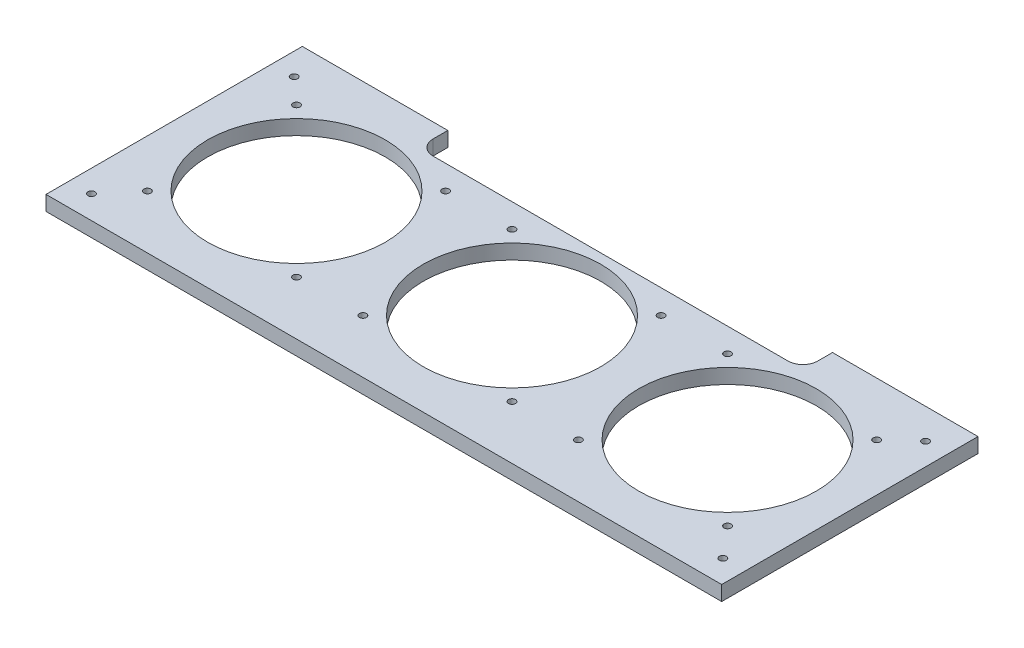
ISO-10303-21;
HEADER;
FILE_DESCRIPTION(('STEP AP214'),'2;1');
FILE_NAME('part.step','',(''),(''),'','','');
FILE_SCHEMA(('AUTOMOTIVE_DESIGN { 1 0 10303 214 1 1 1 1 }'));
ENDSEC;
DATA;
#1=APPLICATION_CONTEXT('core data for automotive mechanical design processes');
#2=APPLICATION_PROTOCOL_DEFINITION('international standard','automotive_design',2000,#1);
#3=PRODUCT_CONTEXT('',#1,'mechanical');
#4=PRODUCT('Part','Part','',(#3));
#5=PRODUCT_RELATED_PRODUCT_CATEGORY('part','',(#4));
#6=PRODUCT_DEFINITION_FORMATION('','',#4);
#7=PRODUCT_DEFINITION_CONTEXT('part definition',#1,'design');
#8=PRODUCT_DEFINITION('design','',#6,#7);
#9=PRODUCT_DEFINITION_SHAPE('','',#8);
#10=(LENGTH_UNIT() NAMED_UNIT(*) SI_UNIT(.MILLI.,.METRE.));
#11=(NAMED_UNIT(*) PLANE_ANGLE_UNIT() SI_UNIT($,.RADIAN.));
#12=(NAMED_UNIT(*) SI_UNIT($,.STERADIAN.) SOLID_ANGLE_UNIT());
#13=UNCERTAINTY_MEASURE_WITH_UNIT(LENGTH_MEASURE(1.E-05),#10,'distance_accuracy_value','');
#14=(GEOMETRIC_REPRESENTATION_CONTEXT(3) GLOBAL_UNCERTAINTY_ASSIGNED_CONTEXT((#13)) GLOBAL_UNIT_ASSIGNED_CONTEXT((#10,
#11,#12)) REPRESENTATION_CONTEXT('',''));
#15=CARTESIAN_POINT('',(0.,0.,0.));
#16=DIRECTION('',(0.,0.,1.));
#17=DIRECTION('',(1.,0.,0.));
#18=AXIS2_PLACEMENT_3D('',#15,#16,#17);
#19=CARTESIAN_POINT('',(0.,3.175,-55.));
#20=DIRECTION('',(0.,0.,1.));
#21=DIRECTION('',(1.,0.,0.));
#22=AXIS2_PLACEMENT_3D('',#19,#20,#21);
#23=PLANE('',#22);
#24=DIRECTION('',(-1.,0.,0.));
#25=VECTOR('',#24,1.);
#26=CARTESIAN_POINT('',(0.,0.,-55.));
#27=LINE('',#26,#25);
#28=CARTESIAN_POINT('',(145.,0.,-55.));
#29=VERTEX_POINT('',#28);
#30=CARTESIAN_POINT('',(113.775,0.,-55.));
#31=VERTEX_POINT('',#30);
#32=EDGE_CURVE('E257',#29,#31,#27,.T.);
#33=ORIENTED_EDGE('',*,*,#32,.T.);
#34=DIRECTION('',(0.,-1.,0.));
#35=VECTOR('',#34,1.);
#36=CARTESIAN_POINT('',(113.775,3.175,-55.));
#37=LINE('',#36,#35);
#38=CARTESIAN_POINT('',(113.775,3.175,-55.));
#39=VERTEX_POINT('',#38);
#40=EDGE_CURVE('E209',#39,#31,#37,.T.);
#41=ORIENTED_EDGE('',*,*,#40,.F.);
#42=DIRECTION('',(-1.,0.,0.));
#43=VECTOR('',#42,1.);
#44=CARTESIAN_POINT('',(0.,3.175,-55.));
#45=LINE('',#44,#43);
#46=CARTESIAN_POINT('',(145.,3.175,-55.));
#47=VERTEX_POINT('',#46);
#48=EDGE_CURVE('E168',#47,#39,#45,.T.);
#49=ORIENTED_EDGE('',*,*,#48,.F.);
#50=DIRECTION('',(0.,-1.,0.));
#51=VECTOR('',#50,1.);
#52=CARTESIAN_POINT('',(145.,3.175,-55.));
#53=LINE('',#52,#51);
#54=EDGE_CURVE('E268',#47,#29,#53,.T.);
#55=ORIENTED_EDGE('',*,*,#54,.T.);
#56=EDGE_LOOP('',(#33,#41,#49,#55));
#57=FACE_BOUND('',#56,.T.);
#58=ADVANCED_FACE('F41',(#57),#23,.F.);
#59=CARTESIAN_POINT('',(0.,3.175,0.));
#60=DIRECTION('',(1.,0.,0.));
#61=DIRECTION('',(0.,0.,-1.));
#62=AXIS2_PLACEMENT_3D('',#59,#60,#61);
#63=PLANE('',#62);
#64=DIRECTION('',(0.,0.,1.));
#65=VECTOR('',#64,1.);
#66=CARTESIAN_POINT('',(0.,0.,0.));
#67=LINE('',#66,#65);
#68=CARTESIAN_POINT('',(0.,0.,-55.));
#69=VERTEX_POINT('',#68);
#70=CARTESIAN_POINT('',(0.,0.,0.));
#71=VERTEX_POINT('',#70);
#72=EDGE_CURVE('E176',#69,#71,#67,.T.);
#73=ORIENTED_EDGE('',*,*,#72,.T.);
#74=DIRECTION('',(0.,-1.,0.));
#75=VECTOR('',#74,1.);
#76=CARTESIAN_POINT('',(0.,3.175,0.));
#77=LINE('',#76,#75);
#78=CARTESIAN_POINT('',(0.,3.175,0.));
#79=VERTEX_POINT('',#78);
#80=EDGE_CURVE('E12',#79,#71,#77,.T.);
#81=ORIENTED_EDGE('',*,*,#80,.F.);
#82=DIRECTION('',(0.,0.,1.));
#83=VECTOR('',#82,1.);
#84=CARTESIAN_POINT('',(0.,3.175,0.));
#85=LINE('',#84,#83);
#86=CARTESIAN_POINT('',(0.,3.175,-55.));
#87=VERTEX_POINT('',#86);
#88=EDGE_CURVE('E254',#87,#79,#85,.T.);
#89=ORIENTED_EDGE('',*,*,#88,.F.);
#90=DIRECTION('',(0.,-1.,0.));
#91=VECTOR('',#90,1.);
#92=CARTESIAN_POINT('',(0.,3.175,-55.));
#93=LINE('',#92,#91);
#94=EDGE_CURVE('E172',#87,#69,#93,.T.);
#95=ORIENTED_EDGE('',*,*,#94,.T.);
#96=EDGE_LOOP('',(#73,#81,#89,#95));
#97=FACE_BOUND('',#96,.T.);
#98=ADVANCED_FACE('F43',(#97),#63,.F.);
#99=CARTESIAN_POINT('',(0.,3.175,0.));
#100=DIRECTION('',(0.,0.,-1.));
#101=DIRECTION('',(-1.,0.,0.));
#102=AXIS2_PLACEMENT_3D('',#99,#100,#101);
#103=PLANE('',#102);
#104=DIRECTION('',(1.,0.,0.));
#105=VECTOR('',#104,1.);
#106=CARTESIAN_POINT('',(0.,0.,0.));
#107=LINE('',#106,#105);
#108=CARTESIAN_POINT('',(145.,0.,0.));
#109=VERTEX_POINT('',#108);
#110=EDGE_CURVE('E298',#71,#109,#107,.T.);
#111=ORIENTED_EDGE('',*,*,#110,.T.);
#112=DIRECTION('',(0.,-1.,0.));
#113=VECTOR('',#112,1.);
#114=CARTESIAN_POINT('',(145.,3.175,0.));
#115=LINE('',#114,#113);
#116=CARTESIAN_POINT('',(145.,3.175,0.));
#117=VERTEX_POINT('',#116);
#118=EDGE_CURVE('E49',#117,#109,#115,.T.);
#119=ORIENTED_EDGE('',*,*,#118,.F.);
#120=DIRECTION('',(1.,0.,0.));
#121=VECTOR('',#120,1.);
#122=CARTESIAN_POINT('',(0.,3.175,0.));
#123=LINE('',#122,#121);
#124=EDGE_CURVE('E94',#79,#117,#123,.T.);
#125=ORIENTED_EDGE('',*,*,#124,.F.);
#126=ORIENTED_EDGE('',*,*,#80,.T.);
#127=EDGE_LOOP('',(#111,#119,#125,#126));
#128=FACE_BOUND('',#127,.T.);
#129=ADVANCED_FACE('F297',(#128),#103,.F.);
#130=CARTESIAN_POINT('',(145.,3.175,0.));
#131=DIRECTION('',(-1.,0.,0.));
#132=DIRECTION('',(0.,0.,1.));
#133=AXIS2_PLACEMENT_3D('',#130,#131,#132);
#134=PLANE('',#133);
#135=DIRECTION('',(0.,0.,-1.));
#136=VECTOR('',#135,1.);
#137=CARTESIAN_POINT('',(145.,0.,0.));
#138=LINE('',#137,#136);
#139=EDGE_CURVE('E271',#109,#29,#138,.T.);
#140=ORIENTED_EDGE('',*,*,#139,.T.);
#141=ORIENTED_EDGE('',*,*,#54,.F.);
#142=DIRECTION('',(0.,0.,-1.));
#143=VECTOR('',#142,1.);
#144=CARTESIAN_POINT('',(145.,3.175,0.));
#145=LINE('',#144,#143);
#146=EDGE_CURVE('E173',#117,#47,#145,.T.);
#147=ORIENTED_EDGE('',*,*,#146,.F.);
#148=ORIENTED_EDGE('',*,*,#118,.T.);
#149=EDGE_LOOP('',(#140,#141,#147,#148));
#150=FACE_BOUND('',#149,.T.);
#151=ADVANCED_FACE('F269',(#150),#134,.F.);
#152=CARTESIAN_POINT('',(31.225,3.175,-55.));
#153=VERTEX_POINT('',#152);
#154=EDGE_CURVE('E65',#153,#87,#45,.T.);
#155=ORIENTED_EDGE('',*,*,#154,.F.);
#156=DIRECTION('',(0.,-1.,0.));
#157=VECTOR('',#156,1.);
#158=CARTESIAN_POINT('',(31.225,3.175,-55.));
#159=LINE('',#158,#157);
#160=CARTESIAN_POINT('',(31.225,0.,-55.));
#161=VERTEX_POINT('',#160);
#162=EDGE_CURVE('E134',#153,#161,#159,.T.);
#163=ORIENTED_EDGE('',*,*,#162,.T.);
#164=EDGE_CURVE('E87',#161,#69,#27,.T.);
#165=ORIENTED_EDGE('',*,*,#164,.T.);
#166=ORIENTED_EDGE('',*,*,#94,.F.);
#167=EDGE_LOOP('',(#155,#163,#165,#166));
#168=FACE_BOUND('',#167,.T.);
#169=ADVANCED_FACE('F291',(#168),#23,.F.);
#170=CARTESIAN_POINT('',(0.,3.175,0.));
#171=DIRECTION('',(0.,-1.,0.));
#172=DIRECTION('',(0.,0.,-1.));
#173=AXIS2_PLACEMENT_3D('',#170,#171,#172);
#174=PLANE('',#173);
#175=CARTESIAN_POINT('',(134.75,3.175,-43.5));
#176=DIRECTION('',(0.,-1.,0.));
#177=DIRECTION('',(0.,0.,-1.));
#178=AXIS2_PLACEMENT_3D('',#175,#176,#177);
#179=CIRCLE('',#178,0.750000000000012);
#180=CARTESIAN_POINT('',(134.75,3.175,-44.25));
#181=VERTEX_POINT('',#180);
#182=EDGE_CURVE('E516',#181,#181,#179,.T.);
#183=ORIENTED_EDGE('',*,*,#182,.T.);
#184=EDGE_LOOP('',(#183));
#185=FACE_BOUND('',#184,.T.);
#186=CARTESIAN_POINT('',(118.75,3.175,-27.5));
#187=DIRECTION('',(0.,-1.,0.));
#188=DIRECTION('',(0.,0.,-1.));
#189=AXIS2_PLACEMENT_3D('',#186,#187,#188);
#190=CIRCLE('',#189,19.05);
#191=CARTESIAN_POINT('',(118.75,3.175,-46.55));
#192=VERTEX_POINT('',#191);
#193=EDGE_CURVE('E536',#192,#192,#190,.T.);
#194=ORIENTED_EDGE('',*,*,#193,.T.);
#195=EDGE_LOOP('',(#194));
#196=FACE_BOUND('',#195,.T.);
#197=CARTESIAN_POINT('',(134.75,3.175,-11.5));
#198=DIRECTION('',(0.,-1.,0.));
#199=DIRECTION('',(0.,0.,-1.));
#200=AXIS2_PLACEMENT_3D('',#197,#198,#199);
#201=CIRCLE('',#200,0.750000000000012);
#202=CARTESIAN_POINT('',(134.75,3.175,-12.25));
#203=VERTEX_POINT('',#202);
#204=EDGE_CURVE('E526',#203,#203,#201,.T.);
#205=ORIENTED_EDGE('',*,*,#204,.T.);
#206=EDGE_LOOP('',(#205));
#207=FACE_BOUND('',#206,.T.);
#208=CARTESIAN_POINT('',(102.75,3.175,-43.5));
#209=DIRECTION('',(0.,-1.,0.));
#210=DIRECTION('',(0.,0.,-1.));
#211=AXIS2_PLACEMENT_3D('',#208,#209,#210);
#212=CIRCLE('',#211,0.749999999999999);
#213=CARTESIAN_POINT('',(102.75,3.175,-44.25));
#214=VERTEX_POINT('',#213);
#215=EDGE_CURVE('E515',#214,#214,#212,.T.);
#216=ORIENTED_EDGE('',*,*,#215,.T.);
#217=EDGE_LOOP('',(#216));
#218=FACE_BOUND('',#217,.T.);
#219=CARTESIAN_POINT('',(102.75,3.175,-11.5));
#220=DIRECTION('',(0.,-1.,0.));
#221=DIRECTION('',(0.,0.,-1.));
#222=AXIS2_PLACEMENT_3D('',#219,#220,#221);
#223=CIRCLE('',#222,0.749999999999999);
#224=CARTESIAN_POINT('',(102.75,3.175,-12.25));
#225=VERTEX_POINT('',#224);
#226=EDGE_CURVE('E541',#225,#225,#223,.T.);
#227=ORIENTED_EDGE('',*,*,#226,.T.);
#228=EDGE_LOOP('',(#227));
#229=FACE_BOUND('',#228,.T.);
#230=CARTESIAN_POINT('',(140.250001149288,3.175,-48.5000025403915));
#231=DIRECTION('',(0.,-1.,0.));
#232=DIRECTION('',(0.,0.,-1.));
#233=AXIS2_PLACEMENT_3D('',#230,#231,#232);
#234=CIRCLE('',#233,0.750000000000012);
#235=CARTESIAN_POINT('',(140.250001149288,3.175,-49.2500025403915));
#236=VERTEX_POINT('',#235);
#237=EDGE_CURVE('E434',#236,#236,#234,.T.);
#238=ORIENTED_EDGE('',*,*,#237,.T.);
#239=EDGE_LOOP('',(#238));
#240=FACE_BOUND('',#239,.T.);
#241=CARTESIAN_POINT('',(140.249999576477,3.175,-5.00000318039152));
#242=DIRECTION('',(0.,-1.,0.));
#243=DIRECTION('',(0.,0.,-1.));
#244=AXIS2_PLACEMENT_3D('',#241,#242,#243);
#245=CIRCLE('',#244,0.750000000000012);
#246=CARTESIAN_POINT('',(140.249999576477,3.175,-5.75000318039154));
#247=VERTEX_POINT('',#246);
#248=EDGE_CURVE('E420',#247,#247,#245,.T.);
#249=ORIENTED_EDGE('',*,*,#248,.T.);
#250=EDGE_LOOP('',(#249));
#251=FACE_BOUND('',#250,.T.);
#252=CARTESIAN_POINT('',(4.74999879647701,3.175,-5.00000807960851));
#253=DIRECTION('',(0.,-1.,0.));
#254=DIRECTION('',(0.,0.,-1.));
#255=AXIS2_PLACEMENT_3D('',#252,#253,#254);
#256=CIRCLE('',#255,0.75);
#257=CARTESIAN_POINT('',(4.74999879647701,3.175,-5.75000807960851));
#258=VERTEX_POINT('',#257);
#259=EDGE_CURVE('E415',#258,#258,#256,.T.);
#260=ORIENTED_EDGE('',*,*,#259,.T.);
#261=EDGE_LOOP('',(#260));
#262=FACE_BOUND('',#261,.T.);
#263=CARTESIAN_POINT('',(4.75000036928834,3.175,-48.5000074396085));
#264=DIRECTION('',(0.,-1.,0.));
#265=DIRECTION('',(0.,0.,-1.));
#266=AXIS2_PLACEMENT_3D('',#263,#264,#265);
#267=CIRCLE('',#266,0.75);
#268=CARTESIAN_POINT('',(4.75000036928834,3.175,-49.2500074396085));
#269=VERTEX_POINT('',#268);
#270=EDGE_CURVE('E195',#269,#269,#267,.T.);
#271=ORIENTED_EDGE('',*,*,#270,.T.);
#272=EDGE_LOOP('',(#271));
#273=FACE_BOUND('',#272,.T.);
#274=CARTESIAN_POINT('',(56.4999999999999,3.175,-11.5));
#275=DIRECTION('',(0.,-1.,0.));
#276=DIRECTION('',(0.,0.,-1.));
#277=AXIS2_PLACEMENT_3D('',#274,#275,#276);
#278=CIRCLE('',#277,0.749999999999999);
#279=CARTESIAN_POINT('',(56.4999999999999,3.175,-12.25));
#280=VERTEX_POINT('',#279);
#281=EDGE_CURVE('E227',#280,#280,#278,.T.);
#282=ORIENTED_EDGE('',*,*,#281,.T.);
#283=EDGE_LOOP('',(#282));
#284=FACE_BOUND('',#283,.T.);
#285=CARTESIAN_POINT('',(56.4999999999999,3.175,-43.5));
#286=DIRECTION('',(0.,-1.,0.));
#287=DIRECTION('',(0.,0.,-1.));
#288=AXIS2_PLACEMENT_3D('',#285,#286,#287);
#289=CIRCLE('',#288,0.749999999999999);
#290=CARTESIAN_POINT('',(56.4999999999999,3.175,-44.25));
#291=VERTEX_POINT('',#290);
#292=EDGE_CURVE('E238',#291,#291,#289,.T.);
#293=ORIENTED_EDGE('',*,*,#292,.T.);
#294=EDGE_LOOP('',(#293));
#295=FACE_BOUND('',#294,.T.);
#296=CARTESIAN_POINT('',(88.4999999999999,3.175,-11.5));
#297=DIRECTION('',(0.,-1.,0.));
#298=DIRECTION('',(0.,0.,-1.));
#299=AXIS2_PLACEMENT_3D('',#296,#297,#298);
#300=CIRCLE('',#299,0.749999999999999);
#301=CARTESIAN_POINT('',(88.4999999999999,3.175,-12.25));
#302=VERTEX_POINT('',#301);
#303=EDGE_CURVE('E466',#302,#302,#300,.T.);
#304=ORIENTED_EDGE('',*,*,#303,.T.);
#305=EDGE_LOOP('',(#304));
#306=FACE_BOUND('',#305,.T.);
#307=CARTESIAN_POINT('',(72.4999999999999,3.175,-27.5));
#308=DIRECTION('',(0.,-1.,0.));
#309=DIRECTION('',(0.,0.,-1.));
#310=AXIS2_PLACEMENT_3D('',#307,#308,#309);
#311=CIRCLE('',#310,19.05);
#312=CARTESIAN_POINT('',(72.4999999999999,3.175,-46.55));
#313=VERTEX_POINT('',#312);
#314=EDGE_CURVE('E470',#313,#313,#311,.T.);
#315=ORIENTED_EDGE('',*,*,#314,.T.);
#316=EDGE_LOOP('',(#315));
#317=FACE_BOUND('',#316,.T.);
#318=CARTESIAN_POINT('',(88.4999999999999,3.175,-43.5));
#319=DIRECTION('',(0.,-1.,0.));
#320=DIRECTION('',(0.,0.,-1.));
#321=AXIS2_PLACEMENT_3D('',#318,#319,#320);
#322=CIRCLE('',#321,0.749999999999999);
#323=CARTESIAN_POINT('',(88.4999999999999,3.175,-44.25));
#324=VERTEX_POINT('',#323);
#325=EDGE_CURVE('E245',#324,#324,#322,.T.);
#326=ORIENTED_EDGE('',*,*,#325,.T.);
#327=EDGE_LOOP('',(#326));
#328=FACE_BOUND('',#327,.T.);
#329=CARTESIAN_POINT('',(10.2499999999998,3.175,-43.5));
#330=DIRECTION('',(0.,-1.,0.));
#331=DIRECTION('',(0.,0.,-1.));
#332=AXIS2_PLACEMENT_3D('',#329,#330,#331);
#333=CIRCLE('',#332,0.75);
#334=CARTESIAN_POINT('',(10.2499999999998,3.175,-44.25));
#335=VERTEX_POINT('',#334);
#336=EDGE_CURVE('E253',#335,#335,#333,.T.);
#337=ORIENTED_EDGE('',*,*,#336,.T.);
#338=EDGE_LOOP('',(#337));
#339=FACE_BOUND('',#338,.T.);
#340=CARTESIAN_POINT('',(42.2499999999998,3.175,-43.5));
#341=DIRECTION('',(0.,-1.,0.));
#342=DIRECTION('',(0.,0.,-1.));
#343=AXIS2_PLACEMENT_3D('',#340,#341,#342);
#344=CIRCLE('',#343,0.749999999999999);
#345=CARTESIAN_POINT('',(42.2499999999998,3.175,-44.25));
#346=VERTEX_POINT('',#345);
#347=EDGE_CURVE('E480',#346,#346,#344,.T.);
#348=ORIENTED_EDGE('',*,*,#347,.T.);
#349=EDGE_LOOP('',(#348));
#350=FACE_BOUND('',#349,.T.);
#351=CARTESIAN_POINT('',(42.2499999999998,3.175,-11.5));
#352=DIRECTION('',(0.,-1.,0.));
#353=DIRECTION('',(0.,0.,-1.));
#354=AXIS2_PLACEMENT_3D('',#351,#352,#353);
#355=CIRCLE('',#354,0.749999999999999);
#356=CARTESIAN_POINT('',(42.2499999999998,3.175,-12.25));
#357=VERTEX_POINT('',#356);
#358=EDGE_CURVE('E484',#357,#357,#355,.T.);
#359=ORIENTED_EDGE('',*,*,#358,.T.);
#360=EDGE_LOOP('',(#359));
#361=FACE_BOUND('',#360,.T.);
#362=CARTESIAN_POINT('',(26.2499999999998,3.175,-27.5));
#363=DIRECTION('',(0.,-1.,0.));
#364=DIRECTION('',(0.,0.,-1.));
#365=AXIS2_PLACEMENT_3D('',#362,#363,#364);
#366=CIRCLE('',#365,19.05);
#367=CARTESIAN_POINT('',(26.2499999999998,3.175,-46.55));
#368=VERTEX_POINT('',#367);
#369=EDGE_CURVE('E488',#368,#368,#366,.T.);
#370=ORIENTED_EDGE('',*,*,#369,.T.);
#371=EDGE_LOOP('',(#370));
#372=FACE_BOUND('',#371,.T.);
#373=CARTESIAN_POINT('',(10.2499999999998,3.175,-11.5));
#374=DIRECTION('',(0.,-1.,0.));
#375=DIRECTION('',(0.,0.,-1.));
#376=AXIS2_PLACEMENT_3D('',#373,#374,#375);
#377=CIRCLE('',#376,0.749999999999998);
#378=CARTESIAN_POINT('',(10.2499999999998,3.175,-12.25));
#379=VERTEX_POINT('',#378);
#380=EDGE_CURVE('E246',#379,#379,#377,.T.);
#381=ORIENTED_EDGE('',*,*,#380,.T.);
#382=EDGE_LOOP('',(#381));
#383=FACE_BOUND('',#382,.T.);
#384=ORIENTED_EDGE('',*,*,#48,.T.);
#385=DIRECTION('',(0.,0.,1.));
#386=VECTOR('',#385,1.);
#387=CARTESIAN_POINT('',(113.775,3.175,-51.825));
#388=LINE('',#387,#386);
#389=CARTESIAN_POINT('',(113.775,3.175,-51.825));
#390=VERTEX_POINT('',#389);
#391=EDGE_CURVE('E140',#39,#390,#388,.T.);
#392=ORIENTED_EDGE('',*,*,#391,.T.);
#393=CARTESIAN_POINT('',(110.6,3.175,-51.825));
#394=DIRECTION('',(0.,-1.,0.));
#395=DIRECTION('',(0.,0.,1.));
#396=AXIS2_PLACEMENT_3D('',#393,#394,#395);
#397=CIRCLE('',#396,3.175);
#398=CARTESIAN_POINT('',(110.6,3.175,-48.65));
#399=VERTEX_POINT('',#398);
#400=EDGE_CURVE('E188',#390,#399,#397,.T.);
#401=ORIENTED_EDGE('',*,*,#400,.T.);
#402=DIRECTION('',(-1.,0.,0.));
#403=VECTOR('',#402,1.);
#404=CARTESIAN_POINT('',(110.6,3.175,-48.65));
#405=LINE('',#404,#403);
#406=CARTESIAN_POINT('',(34.4,3.175,-48.65));
#407=VERTEX_POINT('',#406);
#408=EDGE_CURVE('E135',#399,#407,#405,.T.);
#409=ORIENTED_EDGE('',*,*,#408,.T.);
#410=CARTESIAN_POINT('',(34.4,3.175,-51.825));
#411=DIRECTION('',(0.,-1.,0.));
#412=DIRECTION('',(0.,0.,1.));
#413=AXIS2_PLACEMENT_3D('',#410,#411,#412);
#414=CIRCLE('',#413,3.175);
#415=CARTESIAN_POINT('',(31.225,3.175,-51.825));
#416=VERTEX_POINT('',#415);
#417=EDGE_CURVE('E130',#407,#416,#414,.T.);
#418=ORIENTED_EDGE('',*,*,#417,.T.);
#419=DIRECTION('',(0.,0.,-1.));
#420=VECTOR('',#419,1.);
#421=CARTESIAN_POINT('',(31.225,3.175,-51.825));
#422=LINE('',#421,#420);
#423=EDGE_CURVE('E137',#416,#153,#422,.T.);
#424=ORIENTED_EDGE('',*,*,#423,.T.);
#425=ORIENTED_EDGE('',*,*,#154,.T.);
#426=ORIENTED_EDGE('',*,*,#88,.T.);
#427=ORIENTED_EDGE('',*,*,#124,.T.);
#428=ORIENTED_EDGE('',*,*,#146,.T.);
#429=EDGE_LOOP('',(#384,#392,#401,#409,#418,#424,#425,#426,#427,#428));
#430=FACE_BOUND('',#429,.T.);
#431=ADVANCED_FACE('F143',(#185,#196,#207,#218,#229,#240,#251,#262,#273,#284,#295,#306,#317,
#328,#339,#350,#361,#372,#383,#430),#174,.F.);
#432=CARTESIAN_POINT('',(0.,0.,0.));
#433=DIRECTION('',(0.,-1.,0.));
#434=DIRECTION('',(0.,0.,-1.));
#435=AXIS2_PLACEMENT_3D('',#432,#433,#434);
#436=PLANE('',#435);
#437=CARTESIAN_POINT('',(134.75,0.,-43.5));
#438=DIRECTION('',(0.,-1.,0.));
#439=DIRECTION('',(0.,0.,-1.));
#440=AXIS2_PLACEMENT_3D('',#437,#438,#439);
#441=CIRCLE('',#440,0.750000000000012);
#442=CARTESIAN_POINT('',(134.75,0.,-44.25));
#443=VERTEX_POINT('',#442);
#444=EDGE_CURVE('E532',#443,#443,#441,.T.);
#445=ORIENTED_EDGE('',*,*,#444,.F.);
#446=EDGE_LOOP('',(#445));
#447=FACE_BOUND('',#446,.T.);
#448=CARTESIAN_POINT('',(118.75,0.,-27.5));
#449=DIRECTION('',(0.,-1.,0.));
#450=DIRECTION('',(0.,0.,-1.));
#451=AXIS2_PLACEMENT_3D('',#448,#449,#450);
#452=CIRCLE('',#451,19.05);
#453=CARTESIAN_POINT('',(118.75,0.,-46.55));
#454=VERTEX_POINT('',#453);
#455=EDGE_CURVE('E204',#454,#454,#452,.T.);
#456=ORIENTED_EDGE('',*,*,#455,.F.);
#457=EDGE_LOOP('',(#456));
#458=FACE_BOUND('',#457,.T.);
#459=CARTESIAN_POINT('',(134.75,0.,-11.5));
#460=DIRECTION('',(0.,-1.,0.));
#461=DIRECTION('',(0.,0.,-1.));
#462=AXIS2_PLACEMENT_3D('',#459,#460,#461);
#463=CIRCLE('',#462,0.750000000000012);
#464=CARTESIAN_POINT('',(134.75,0.,-12.25));
#465=VERTEX_POINT('',#464);
#466=EDGE_CURVE('E533',#465,#465,#463,.T.);
#467=ORIENTED_EDGE('',*,*,#466,.F.);
#468=EDGE_LOOP('',(#467));
#469=FACE_BOUND('',#468,.T.);
#470=CARTESIAN_POINT('',(102.75,0.,-43.5));
#471=DIRECTION('',(0.,-1.,0.));
#472=DIRECTION('',(0.,0.,-1.));
#473=AXIS2_PLACEMENT_3D('',#470,#471,#472);
#474=CIRCLE('',#473,0.749999999999999);
#475=CARTESIAN_POINT('',(102.75,0.,-44.25));
#476=VERTEX_POINT('',#475);
#477=EDGE_CURVE('E512',#476,#476,#474,.T.);
#478=ORIENTED_EDGE('',*,*,#477,.F.);
#479=EDGE_LOOP('',(#478));
#480=FACE_BOUND('',#479,.T.);
#481=CARTESIAN_POINT('',(102.75,0.,-11.5));
#482=DIRECTION('',(0.,-1.,0.));
#483=DIRECTION('',(0.,0.,-1.));
#484=AXIS2_PLACEMENT_3D('',#481,#482,#483);
#485=CIRCLE('',#484,0.749999999999999);
#486=CARTESIAN_POINT('',(102.75,0.,-12.25));
#487=VERTEX_POINT('',#486);
#488=EDGE_CURVE('E521',#487,#487,#485,.T.);
#489=ORIENTED_EDGE('',*,*,#488,.F.);
#490=EDGE_LOOP('',(#489));
#491=FACE_BOUND('',#490,.T.);
#492=CARTESIAN_POINT('',(140.250001149288,0.,-48.5000025403915));
#493=DIRECTION('',(0.,-1.,0.));
#494=DIRECTION('',(0.,0.,-1.));
#495=AXIS2_PLACEMENT_3D('',#492,#493,#494);
#496=CIRCLE('',#495,0.750000000000012);
#497=CARTESIAN_POINT('',(140.250001149288,0.,-49.2500025403915));
#498=VERTEX_POINT('',#497);
#499=EDGE_CURVE('E155',#498,#498,#496,.T.);
#500=ORIENTED_EDGE('',*,*,#499,.F.);
#501=EDGE_LOOP('',(#500));
#502=FACE_BOUND('',#501,.T.);
#503=CARTESIAN_POINT('',(140.249999576477,0.,-5.00000318039152));
#504=DIRECTION('',(0.,-1.,0.));
#505=DIRECTION('',(0.,0.,-1.));
#506=AXIS2_PLACEMENT_3D('',#503,#504,#505);
#507=CIRCLE('',#506,0.750000000000012);
#508=CARTESIAN_POINT('',(140.249999576477,0.,-5.75000318039154));
#509=VERTEX_POINT('',#508);
#510=EDGE_CURVE('E425',#509,#509,#507,.T.);
#511=ORIENTED_EDGE('',*,*,#510,.F.);
#512=EDGE_LOOP('',(#511));
#513=FACE_BOUND('',#512,.T.);
#514=CARTESIAN_POINT('',(4.74999879647701,0.,-5.00000807960851));
#515=DIRECTION('',(0.,-1.,0.));
#516=DIRECTION('',(0.,0.,-1.));
#517=AXIS2_PLACEMENT_3D('',#514,#515,#516);
#518=CIRCLE('',#517,0.75);
#519=CARTESIAN_POINT('',(4.74999879647701,0.,-5.75000807960851));
#520=VERTEX_POINT('',#519);
#521=EDGE_CURVE('E418',#520,#520,#518,.T.);
#522=ORIENTED_EDGE('',*,*,#521,.F.);
#523=EDGE_LOOP('',(#522));
#524=FACE_BOUND('',#523,.T.);
#525=CARTESIAN_POINT('',(4.75000036928834,0.,-48.5000074396085));
#526=DIRECTION('',(0.,-1.,0.));
#527=DIRECTION('',(0.,0.,-1.));
#528=AXIS2_PLACEMENT_3D('',#525,#526,#527);
#529=CIRCLE('',#528,0.75);
#530=CARTESIAN_POINT('',(4.75000036928834,0.,-49.2500074396085));
#531=VERTEX_POINT('',#530);
#532=EDGE_CURVE('E216',#531,#531,#529,.T.);
#533=ORIENTED_EDGE('',*,*,#532,.F.);
#534=EDGE_LOOP('',(#533));
#535=FACE_BOUND('',#534,.T.);
#536=DIRECTION('',(0.,0.,1.));
#537=VECTOR('',#536,1.);
#538=CARTESIAN_POINT('',(113.775,0.,-51.825));
#539=LINE('',#538,#537);
#540=CARTESIAN_POINT('',(113.775,0.,-51.825));
#541=VERTEX_POINT('',#540);
#542=EDGE_CURVE('E197',#31,#541,#539,.T.);
#543=ORIENTED_EDGE('',*,*,#542,.F.);
#544=ORIENTED_EDGE('',*,*,#32,.F.);
#545=ORIENTED_EDGE('',*,*,#139,.F.);
#546=ORIENTED_EDGE('',*,*,#110,.F.);
#547=ORIENTED_EDGE('',*,*,#72,.F.);
#548=ORIENTED_EDGE('',*,*,#164,.F.);
#549=DIRECTION('',(0.,0.,-1.));
#550=VECTOR('',#549,1.);
#551=CARTESIAN_POINT('',(31.225,0.,-51.825));
#552=LINE('',#551,#550);
#553=CARTESIAN_POINT('',(31.225,0.,-51.825));
#554=VERTEX_POINT('',#553);
#555=EDGE_CURVE('E194',#554,#161,#552,.T.);
#556=ORIENTED_EDGE('',*,*,#555,.F.);
#557=CARTESIAN_POINT('',(34.4,0.,-51.825));
#558=DIRECTION('',(0.,-1.,0.));
#559=DIRECTION('',(0.,0.,1.));
#560=AXIS2_PLACEMENT_3D('',#557,#558,#559);
#561=CIRCLE('',#560,3.175);
#562=CARTESIAN_POINT('',(34.4,0.,-48.65));
#563=VERTEX_POINT('',#562);
#564=EDGE_CURVE('E56',#563,#554,#561,.T.);
#565=ORIENTED_EDGE('',*,*,#564,.F.);
#566=DIRECTION('',(-1.,0.,0.));
#567=VECTOR('',#566,1.);
#568=CARTESIAN_POINT('',(110.6,0.,-48.65));
#569=LINE('',#568,#567);
#570=CARTESIAN_POINT('',(110.6,0.,-48.65));
#571=VERTEX_POINT('',#570);
#572=EDGE_CURVE('E147',#571,#563,#569,.T.);
#573=ORIENTED_EDGE('',*,*,#572,.F.);
#574=CARTESIAN_POINT('',(110.6,0.,-51.825));
#575=DIRECTION('',(0.,-1.,0.));
#576=DIRECTION('',(0.,0.,1.));
#577=AXIS2_PLACEMENT_3D('',#574,#575,#576);
#578=CIRCLE('',#577,3.175);
#579=EDGE_CURVE('E151',#541,#571,#578,.T.);
#580=ORIENTED_EDGE('',*,*,#579,.F.);
#581=EDGE_LOOP('',(#543,#544,#545,#546,#547,#548,#556,#565,#573,#580));
#582=FACE_BOUND('',#581,.T.);
#583=CARTESIAN_POINT('',(56.4999999999999,0.,-11.5));
#584=DIRECTION('',(0.,-1.,0.));
#585=DIRECTION('',(0.,0.,-1.));
#586=AXIS2_PLACEMENT_3D('',#583,#584,#585);
#587=CIRCLE('',#586,0.749999999999999);
#588=CARTESIAN_POINT('',(56.4999999999999,0.,-12.25));
#589=VERTEX_POINT('',#588);
#590=EDGE_CURVE('E234',#589,#589,#587,.T.);
#591=ORIENTED_EDGE('',*,*,#590,.F.);
#592=EDGE_LOOP('',(#591));
#593=FACE_BOUND('',#592,.T.);
#594=CARTESIAN_POINT('',(56.4999999999999,0.,-43.5));
#595=DIRECTION('',(0.,-1.,0.));
#596=DIRECTION('',(0.,0.,-1.));
#597=AXIS2_PLACEMENT_3D('',#594,#595,#596);
#598=CIRCLE('',#597,0.749999999999999);
#599=CARTESIAN_POINT('',(56.4999999999999,0.,-44.25));
#600=VERTEX_POINT('',#599);
#601=EDGE_CURVE('E243',#600,#600,#598,.T.);
#602=ORIENTED_EDGE('',*,*,#601,.F.);
#603=EDGE_LOOP('',(#602));
#604=FACE_BOUND('',#603,.T.);
#605=CARTESIAN_POINT('',(88.4999999999999,0.,-11.5));
#606=DIRECTION('',(0.,-1.,0.));
#607=DIRECTION('',(0.,0.,-1.));
#608=AXIS2_PLACEMENT_3D('',#605,#606,#607);
#609=CIRCLE('',#608,0.749999999999999);
#610=CARTESIAN_POINT('',(88.4999999999999,0.,-12.25));
#611=VERTEX_POINT('',#610);
#612=EDGE_CURVE('E556',#611,#611,#609,.T.);
#613=ORIENTED_EDGE('',*,*,#612,.F.);
#614=EDGE_LOOP('',(#613));
#615=FACE_BOUND('',#614,.T.);
#616=CARTESIAN_POINT('',(72.4999999999999,0.,-27.5));
#617=DIRECTION('',(0.,-1.,0.));
#618=DIRECTION('',(0.,0.,-1.));
#619=AXIS2_PLACEMENT_3D('',#616,#617,#618);
#620=CIRCLE('',#619,19.05);
#621=CARTESIAN_POINT('',(72.4999999999999,0.,-46.55));
#622=VERTEX_POINT('',#621);
#623=EDGE_CURVE('E544',#622,#622,#620,.T.);
#624=ORIENTED_EDGE('',*,*,#623,.F.);
#625=EDGE_LOOP('',(#624));
#626=FACE_BOUND('',#625,.T.);
#627=CARTESIAN_POINT('',(88.4999999999999,0.,-43.5));
#628=DIRECTION('',(0.,-1.,0.));
#629=DIRECTION('',(0.,0.,-1.));
#630=AXIS2_PLACEMENT_3D('',#627,#628,#629);
#631=CIRCLE('',#630,0.749999999999999);
#632=CARTESIAN_POINT('',(88.4999999999999,0.,-44.25));
#633=VERTEX_POINT('',#632);
#634=EDGE_CURVE('E235',#633,#633,#631,.T.);
#635=ORIENTED_EDGE('',*,*,#634,.F.);
#636=EDGE_LOOP('',(#635));
#637=FACE_BOUND('',#636,.T.);
#638=CARTESIAN_POINT('',(10.2499999999998,0.,-43.5));
#639=DIRECTION('',(0.,-1.,0.));
#640=DIRECTION('',(0.,0.,-1.));
#641=AXIS2_PLACEMENT_3D('',#638,#639,#640);
#642=CIRCLE('',#641,0.75);
#643=CARTESIAN_POINT('',(10.2499999999998,0.,-44.25));
#644=VERTEX_POINT('',#643);
#645=EDGE_CURVE('E576',#644,#644,#642,.T.);
#646=ORIENTED_EDGE('',*,*,#645,.F.);
#647=EDGE_LOOP('',(#646));
#648=FACE_BOUND('',#647,.T.);
#649=CARTESIAN_POINT('',(42.2499999999998,0.,-43.5));
#650=DIRECTION('',(0.,-1.,0.));
#651=DIRECTION('',(0.,0.,-1.));
#652=AXIS2_PLACEMENT_3D('',#649,#650,#651);
#653=CIRCLE('',#652,0.749999999999999);
#654=CARTESIAN_POINT('',(42.2499999999998,0.,-44.25));
#655=VERTEX_POINT('',#654);
#656=EDGE_CURVE('E494',#655,#655,#653,.T.);
#657=ORIENTED_EDGE('',*,*,#656,.F.);
#658=EDGE_LOOP('',(#657));
#659=FACE_BOUND('',#658,.T.);
#660=CARTESIAN_POINT('',(42.2499999999998,0.,-11.5));
#661=DIRECTION('',(0.,-1.,0.));
#662=DIRECTION('',(0.,0.,-1.));
#663=AXIS2_PLACEMENT_3D('',#660,#661,#662);
#664=CIRCLE('',#663,0.749999999999999);
#665=CARTESIAN_POINT('',(42.2499999999998,0.,-12.25));
#666=VERTEX_POINT('',#665);
#667=EDGE_CURVE('E233',#666,#666,#664,.T.);
#668=ORIENTED_EDGE('',*,*,#667,.F.);
#669=EDGE_LOOP('',(#668));
#670=FACE_BOUND('',#669,.T.);
#671=CARTESIAN_POINT('',(26.2499999999998,0.,-27.5));
#672=DIRECTION('',(0.,-1.,0.));
#673=DIRECTION('',(0.,0.,-1.));
#674=AXIS2_PLACEMENT_3D('',#671,#672,#673);
#675=CIRCLE('',#674,19.05);
#676=CARTESIAN_POINT('',(26.2499999999998,0.,-46.55));
#677=VERTEX_POINT('',#676);
#678=EDGE_CURVE('E495',#677,#677,#675,.T.);
#679=ORIENTED_EDGE('',*,*,#678,.F.);
#680=EDGE_LOOP('',(#679));
#681=FACE_BOUND('',#680,.T.);
#682=CARTESIAN_POINT('',(10.2499999999998,0.,-11.5));
#683=DIRECTION('',(0.,-1.,0.));
#684=DIRECTION('',(0.,0.,-1.));
#685=AXIS2_PLACEMENT_3D('',#682,#683,#684);
#686=CIRCLE('',#685,0.749999999999998);
#687=CARTESIAN_POINT('',(10.2499999999998,0.,-12.25));
#688=VERTEX_POINT('',#687);
#689=EDGE_CURVE('E251',#688,#688,#686,.T.);
#690=ORIENTED_EDGE('',*,*,#689,.F.);
#691=EDGE_LOOP('',(#690));
#692=FACE_BOUND('',#691,.T.);
#693=ADVANCED_FACE('F282',(#447,#458,#469,#480,#491,#502,#513,#524,#535,#582,#593,#604,#615,
#626,#637,#648,#659,#670,#681,#692),#436,.T.);
#694=CARTESIAN_POINT('',(10.2499999999998,3.175,-11.5));
#695=DIRECTION('',(0.,-1.,0.));
#696=DIRECTION('',(0.,0.,-1.));
#697=AXIS2_PLACEMENT_3D('',#694,#695,#696);
#698=CYLINDRICAL_SURFACE('',#697,0.749999999999998);
#699=ORIENTED_EDGE('',*,*,#380,.F.);
#700=EDGE_LOOP('',(#699));
#701=FACE_BOUND('',#700,.T.);
#702=ORIENTED_EDGE('',*,*,#689,.T.);
#703=EDGE_LOOP('',(#702));
#704=FACE_BOUND('',#703,.T.);
#705=ADVANCED_FACE('F321',(#701,#704),#698,.F.);
#706=CARTESIAN_POINT('',(26.2499999999998,3.175,-27.5));
#707=DIRECTION('',(0.,-1.,0.));
#708=DIRECTION('',(0.,0.,-1.));
#709=AXIS2_PLACEMENT_3D('',#706,#707,#708);
#710=CYLINDRICAL_SURFACE('',#709,19.05);
#711=ORIENTED_EDGE('',*,*,#369,.F.);
#712=EDGE_LOOP('',(#711));
#713=FACE_BOUND('',#712,.T.);
#714=ORIENTED_EDGE('',*,*,#678,.T.);
#715=EDGE_LOOP('',(#714));
#716=FACE_BOUND('',#715,.T.);
#717=ADVANCED_FACE('F328',(#713,#716),#710,.F.);
#718=CARTESIAN_POINT('',(42.2499999999998,3.175,-11.5));
#719=DIRECTION('',(0.,-1.,0.));
#720=DIRECTION('',(0.,0.,-1.));
#721=AXIS2_PLACEMENT_3D('',#718,#719,#720);
#722=CYLINDRICAL_SURFACE('',#721,0.749999999999999);
#723=ORIENTED_EDGE('',*,*,#358,.F.);
#724=EDGE_LOOP('',(#723));
#725=FACE_BOUND('',#724,.T.);
#726=ORIENTED_EDGE('',*,*,#667,.T.);
#727=EDGE_LOOP('',(#726));
#728=FACE_BOUND('',#727,.T.);
#729=ADVANCED_FACE('F354',(#725,#728),#722,.F.);
#730=CARTESIAN_POINT('',(42.2499999999998,3.175,-43.5));
#731=DIRECTION('',(0.,-1.,0.));
#732=DIRECTION('',(0.,0.,-1.));
#733=AXIS2_PLACEMENT_3D('',#730,#731,#732);
#734=CYLINDRICAL_SURFACE('',#733,0.749999999999999);
#735=ORIENTED_EDGE('',*,*,#347,.F.);
#736=EDGE_LOOP('',(#735));
#737=FACE_BOUND('',#736,.T.);
#738=ORIENTED_EDGE('',*,*,#656,.T.);
#739=EDGE_LOOP('',(#738));
#740=FACE_BOUND('',#739,.T.);
#741=ADVANCED_FACE('F351',(#737,#740),#734,.F.);
#742=CARTESIAN_POINT('',(10.2499999999998,3.175,-43.5));
#743=DIRECTION('',(0.,-1.,0.));
#744=DIRECTION('',(0.,0.,-1.));
#745=AXIS2_PLACEMENT_3D('',#742,#743,#744);
#746=CYLINDRICAL_SURFACE('',#745,0.75);
#747=ORIENTED_EDGE('',*,*,#336,.F.);
#748=EDGE_LOOP('',(#747));
#749=FACE_BOUND('',#748,.T.);
#750=ORIENTED_EDGE('',*,*,#645,.T.);
#751=EDGE_LOOP('',(#750));
#752=FACE_BOUND('',#751,.T.);
#753=ADVANCED_FACE('F343',(#749,#752),#746,.F.);
#754=CARTESIAN_POINT('',(88.4999999999999,3.175,-43.5));
#755=DIRECTION('',(0.,-1.,0.));
#756=DIRECTION('',(0.,0.,-1.));
#757=AXIS2_PLACEMENT_3D('',#754,#755,#756);
#758=CYLINDRICAL_SURFACE('',#757,0.749999999999999);
#759=ORIENTED_EDGE('',*,*,#325,.F.);
#760=EDGE_LOOP('',(#759));
#761=FACE_BOUND('',#760,.T.);
#762=ORIENTED_EDGE('',*,*,#634,.T.);
#763=EDGE_LOOP('',(#762));
#764=FACE_BOUND('',#763,.T.);
#765=ADVANCED_FACE('F339',(#761,#764),#758,.F.);
#766=CARTESIAN_POINT('',(72.4999999999999,3.175,-27.5));
#767=DIRECTION('',(0.,-1.,0.));
#768=DIRECTION('',(0.,0.,-1.));
#769=AXIS2_PLACEMENT_3D('',#766,#767,#768);
#770=CYLINDRICAL_SURFACE('',#769,19.05);
#771=ORIENTED_EDGE('',*,*,#314,.F.);
#772=EDGE_LOOP('',(#771));
#773=FACE_BOUND('',#772,.T.);
#774=ORIENTED_EDGE('',*,*,#623,.T.);
#775=EDGE_LOOP('',(#774));
#776=FACE_BOUND('',#775,.T.);
#777=ADVANCED_FACE('F342',(#773,#776),#770,.F.);
#778=CARTESIAN_POINT('',(88.4999999999999,3.175,-11.5));
#779=DIRECTION('',(0.,-1.,0.));
#780=DIRECTION('',(0.,0.,-1.));
#781=AXIS2_PLACEMENT_3D('',#778,#779,#780);
#782=CYLINDRICAL_SURFACE('',#781,0.749999999999999);
#783=ORIENTED_EDGE('',*,*,#303,.F.);
#784=EDGE_LOOP('',(#783));
#785=FACE_BOUND('',#784,.T.);
#786=ORIENTED_EDGE('',*,*,#612,.T.);
#787=EDGE_LOOP('',(#786));
#788=FACE_BOUND('',#787,.T.);
#789=ADVANCED_FACE('F334',(#785,#788),#782,.F.);
#790=CARTESIAN_POINT('',(56.4999999999999,3.175,-43.5));
#791=DIRECTION('',(0.,-1.,0.));
#792=DIRECTION('',(0.,0.,-1.));
#793=AXIS2_PLACEMENT_3D('',#790,#791,#792);
#794=CYLINDRICAL_SURFACE('',#793,0.749999999999999);
#795=ORIENTED_EDGE('',*,*,#292,.F.);
#796=EDGE_LOOP('',(#795));
#797=FACE_BOUND('',#796,.T.);
#798=ORIENTED_EDGE('',*,*,#601,.T.);
#799=EDGE_LOOP('',(#798));
#800=FACE_BOUND('',#799,.T.);
#801=ADVANCED_FACE('F330',(#797,#800),#794,.F.);
#802=CARTESIAN_POINT('',(56.4999999999999,3.175,-11.5));
#803=DIRECTION('',(0.,-1.,0.));
#804=DIRECTION('',(0.,0.,-1.));
#805=AXIS2_PLACEMENT_3D('',#802,#803,#804);
#806=CYLINDRICAL_SURFACE('',#805,0.749999999999999);
#807=ORIENTED_EDGE('',*,*,#281,.F.);
#808=EDGE_LOOP('',(#807));
#809=FACE_BOUND('',#808,.T.);
#810=ORIENTED_EDGE('',*,*,#590,.T.);
#811=EDGE_LOOP('',(#810));
#812=FACE_BOUND('',#811,.T.);
#813=ADVANCED_FACE('F333',(#809,#812),#806,.F.);
#814=CARTESIAN_POINT('',(34.4,3.175,-51.825));
#815=DIRECTION('',(0.,-1.,0.));
#816=DIRECTION('',(0.,0.,-1.));
#817=AXIS2_PLACEMENT_3D('',#814,#815,#816);
#818=CYLINDRICAL_SURFACE('',#817,3.175);
#819=ORIENTED_EDGE('',*,*,#564,.T.);
#820=DIRECTION('',(0.,-1.,0.));
#821=VECTOR('',#820,1.);
#822=CARTESIAN_POINT('',(31.225,3.175,-51.825));
#823=LINE('',#822,#821);
#824=EDGE_CURVE('E126',#416,#554,#823,.T.);
#825=ORIENTED_EDGE('',*,*,#824,.F.);
#826=ORIENTED_EDGE('',*,*,#417,.F.);
#827=DIRECTION('',(0.,-1.,0.));
#828=VECTOR('',#827,1.);
#829=CARTESIAN_POINT('',(34.4,3.175,-48.65));
#830=LINE('',#829,#828);
#831=EDGE_CURVE('E202',#407,#563,#830,.T.);
#832=ORIENTED_EDGE('',*,*,#831,.T.);
#833=EDGE_LOOP('',(#819,#825,#826,#832));
#834=FACE_BOUND('',#833,.T.);
#835=ADVANCED_FACE('F128',(#834),#818,.F.);
#836=CARTESIAN_POINT('',(110.6,3.175,-48.65));
#837=DIRECTION('',(0.,0.,1.));
#838=DIRECTION('',(1.,0.,0.));
#839=AXIS2_PLACEMENT_3D('',#836,#837,#838);
#840=PLANE('',#839);
#841=ORIENTED_EDGE('',*,*,#572,.T.);
#842=ORIENTED_EDGE('',*,*,#831,.F.);
#843=ORIENTED_EDGE('',*,*,#408,.F.);
#844=DIRECTION('',(0.,-1.,0.));
#845=VECTOR('',#844,1.);
#846=CARTESIAN_POINT('',(110.6,3.175,-48.65));
#847=LINE('',#846,#845);
#848=EDGE_CURVE('E205',#399,#571,#847,.T.);
#849=ORIENTED_EDGE('',*,*,#848,.T.);
#850=EDGE_LOOP('',(#841,#842,#843,#849));
#851=FACE_BOUND('',#850,.T.);
#852=ADVANCED_FACE('F289',(#851),#840,.F.);
#853=CARTESIAN_POINT('',(110.6,3.175,-51.825));
#854=DIRECTION('',(0.,-1.,0.));
#855=DIRECTION('',(0.,0.,-1.));
#856=AXIS2_PLACEMENT_3D('',#853,#854,#855);
#857=CYLINDRICAL_SURFACE('',#856,3.175);
#858=ORIENTED_EDGE('',*,*,#579,.T.);
#859=ORIENTED_EDGE('',*,*,#848,.F.);
#860=ORIENTED_EDGE('',*,*,#400,.F.);
#861=DIRECTION('',(0.,-1.,0.));
#862=VECTOR('',#861,1.);
#863=CARTESIAN_POINT('',(113.775,3.175,-51.825));
#864=LINE('',#863,#862);
#865=EDGE_CURVE('E207',#390,#541,#864,.T.);
#866=ORIENTED_EDGE('',*,*,#865,.T.);
#867=EDGE_LOOP('',(#858,#859,#860,#866));
#868=FACE_BOUND('',#867,.T.);
#869=ADVANCED_FACE('F286',(#868),#857,.F.);
#870=CARTESIAN_POINT('',(113.775,3.175,-51.825));
#871=DIRECTION('',(1.,0.,0.));
#872=DIRECTION('',(0.,0.,-1.));
#873=AXIS2_PLACEMENT_3D('',#870,#871,#872);
#874=PLANE('',#873);
#875=ORIENTED_EDGE('',*,*,#542,.T.);
#876=ORIENTED_EDGE('',*,*,#865,.F.);
#877=ORIENTED_EDGE('',*,*,#391,.F.);
#878=ORIENTED_EDGE('',*,*,#40,.T.);
#879=EDGE_LOOP('',(#875,#876,#877,#878));
#880=FACE_BOUND('',#879,.T.);
#881=ADVANCED_FACE('F279',(#880),#874,.F.);
#882=CARTESIAN_POINT('',(31.225,3.175,-51.825));
#883=DIRECTION('',(-1.,0.,0.));
#884=DIRECTION('',(0.,0.,1.));
#885=AXIS2_PLACEMENT_3D('',#882,#883,#884);
#886=PLANE('',#885);
#887=ORIENTED_EDGE('',*,*,#555,.T.);
#888=ORIENTED_EDGE('',*,*,#162,.F.);
#889=ORIENTED_EDGE('',*,*,#423,.F.);
#890=ORIENTED_EDGE('',*,*,#824,.T.);
#891=EDGE_LOOP('',(#887,#888,#889,#890));
#892=FACE_BOUND('',#891,.T.);
#893=ADVANCED_FACE('F138',(#892),#886,.F.);
#894=CARTESIAN_POINT('',(4.75000036928834,3.175,-48.5000074396085));
#895=DIRECTION('',(0.,-1.,0.));
#896=DIRECTION('',(0.,0.,-1.));
#897=AXIS2_PLACEMENT_3D('',#894,#895,#896);
#898=CYLINDRICAL_SURFACE('',#897,0.75);
#899=ORIENTED_EDGE('',*,*,#270,.F.);
#900=EDGE_LOOP('',(#899));
#901=FACE_BOUND('',#900,.T.);
#902=ORIENTED_EDGE('',*,*,#532,.T.);
#903=EDGE_LOOP('',(#902));
#904=FACE_BOUND('',#903,.T.);
#905=ADVANCED_FACE('F386',(#901,#904),#898,.F.);
#906=CARTESIAN_POINT('',(4.74999879647701,3.175,-5.00000807960851));
#907=DIRECTION('',(0.,-1.,0.));
#908=DIRECTION('',(0.,0.,-1.));
#909=AXIS2_PLACEMENT_3D('',#906,#907,#908);
#910=CYLINDRICAL_SURFACE('',#909,0.75);
#911=ORIENTED_EDGE('',*,*,#259,.F.);
#912=EDGE_LOOP('',(#911));
#913=FACE_BOUND('',#912,.T.);
#914=ORIENTED_EDGE('',*,*,#521,.T.);
#915=EDGE_LOOP('',(#914));
#916=FACE_BOUND('',#915,.T.);
#917=ADVANCED_FACE('F389',(#913,#916),#910,.F.);
#918=CARTESIAN_POINT('',(140.249999576477,3.175,-5.00000318039152));
#919=DIRECTION('',(0.,-1.,0.));
#920=DIRECTION('',(0.,0.,-1.));
#921=AXIS2_PLACEMENT_3D('',#918,#919,#920);
#922=CYLINDRICAL_SURFACE('',#921,0.750000000000012);
#923=ORIENTED_EDGE('',*,*,#248,.F.);
#924=EDGE_LOOP('',(#923));
#925=FACE_BOUND('',#924,.T.);
#926=ORIENTED_EDGE('',*,*,#510,.T.);
#927=EDGE_LOOP('',(#926));
#928=FACE_BOUND('',#927,.T.);
#929=ADVANCED_FACE('F403',(#925,#928),#922,.F.);
#930=CARTESIAN_POINT('',(140.250001149288,3.175,-48.5000025403915));
#931=DIRECTION('',(0.,-1.,0.));
#932=DIRECTION('',(0.,0.,-1.));
#933=AXIS2_PLACEMENT_3D('',#930,#931,#932);
#934=CYLINDRICAL_SURFACE('',#933,0.750000000000012);
#935=ORIENTED_EDGE('',*,*,#237,.F.);
#936=EDGE_LOOP('',(#935));
#937=FACE_BOUND('',#936,.T.);
#938=ORIENTED_EDGE('',*,*,#499,.T.);
#939=EDGE_LOOP('',(#938));
#940=FACE_BOUND('',#939,.T.);
#941=ADVANCED_FACE('F373',(#937,#940),#934,.F.);
#942=CARTESIAN_POINT('',(102.75,3.175,-11.5));
#943=DIRECTION('',(0.,-1.,0.));
#944=DIRECTION('',(0.,0.,-1.));
#945=AXIS2_PLACEMENT_3D('',#942,#943,#944);
#946=CYLINDRICAL_SURFACE('',#945,0.749999999999999);
#947=ORIENTED_EDGE('',*,*,#226,.F.);
#948=EDGE_LOOP('',(#947));
#949=FACE_BOUND('',#948,.T.);
#950=ORIENTED_EDGE('',*,*,#488,.T.);
#951=EDGE_LOOP('',(#950));
#952=FACE_BOUND('',#951,.T.);
#953=ADVANCED_FACE('F369',(#949,#952),#946,.F.);
#954=CARTESIAN_POINT('',(102.75,3.175,-43.5));
#955=DIRECTION('',(0.,-1.,0.));
#956=DIRECTION('',(0.,0.,-1.));
#957=AXIS2_PLACEMENT_3D('',#954,#955,#956);
#958=CYLINDRICAL_SURFACE('',#957,0.749999999999999);
#959=ORIENTED_EDGE('',*,*,#215,.F.);
#960=EDGE_LOOP('',(#959));
#961=FACE_BOUND('',#960,.T.);
#962=ORIENTED_EDGE('',*,*,#477,.T.);
#963=EDGE_LOOP('',(#962));
#964=FACE_BOUND('',#963,.T.);
#965=ADVANCED_FACE('F365',(#961,#964),#958,.F.);
#966=CARTESIAN_POINT('',(134.75,3.175,-11.5));
#967=DIRECTION('',(0.,-1.,0.));
#968=DIRECTION('',(0.,0.,-1.));
#969=AXIS2_PLACEMENT_3D('',#966,#967,#968);
#970=CYLINDRICAL_SURFACE('',#969,0.750000000000012);
#971=ORIENTED_EDGE('',*,*,#204,.F.);
#972=EDGE_LOOP('',(#971));
#973=FACE_BOUND('',#972,.T.);
#974=ORIENTED_EDGE('',*,*,#466,.T.);
#975=EDGE_LOOP('',(#974));
#976=FACE_BOUND('',#975,.T.);
#977=ADVANCED_FACE('F368',(#973,#976),#970,.F.);
#978=CARTESIAN_POINT('',(118.75,3.175,-27.5));
#979=DIRECTION('',(0.,-1.,0.));
#980=DIRECTION('',(0.,0.,-1.));
#981=AXIS2_PLACEMENT_3D('',#978,#979,#980);
#982=CYLINDRICAL_SURFACE('',#981,19.05);
#983=ORIENTED_EDGE('',*,*,#193,.F.);
#984=EDGE_LOOP('',(#983));
#985=FACE_BOUND('',#984,.T.);
#986=ORIENTED_EDGE('',*,*,#455,.T.);
#987=EDGE_LOOP('',(#986));
#988=FACE_BOUND('',#987,.T.);
#989=ADVANCED_FACE('F378',(#985,#988),#982,.F.);
#990=CARTESIAN_POINT('',(134.75,3.175,-43.5));
#991=DIRECTION('',(0.,-1.,0.));
#992=DIRECTION('',(0.,0.,-1.));
#993=AXIS2_PLACEMENT_3D('',#990,#991,#992);
#994=CYLINDRICAL_SURFACE('',#993,0.750000000000012);
#995=ORIENTED_EDGE('',*,*,#182,.F.);
#996=EDGE_LOOP('',(#995));
#997=FACE_BOUND('',#996,.T.);
#998=ORIENTED_EDGE('',*,*,#444,.T.);
#999=EDGE_LOOP('',(#998));
#1000=FACE_BOUND('',#999,.T.);
#1001=ADVANCED_FACE('F375',(#997,#1000),#994,.F.);
#1002=CLOSED_SHELL('',(#58,#98,#129,#151,#169,#431,#693,#705,#717,#729,#741,#753,#765,#777,#789,
#801,#813,#835,#852,#869,#881,#893,#905,#917,#929,#941,#953,#965,#977,#989,#1001));
#1003=MANIFOLD_SOLID_BREP('B2',#1002);
#1004=ADVANCED_BREP_SHAPE_REPRESENTATION('',(#18,#1003),#14);
#1005=SHAPE_DEFINITION_REPRESENTATION(#9,#1004);
ENDSEC;
END-ISO-10303-21;
